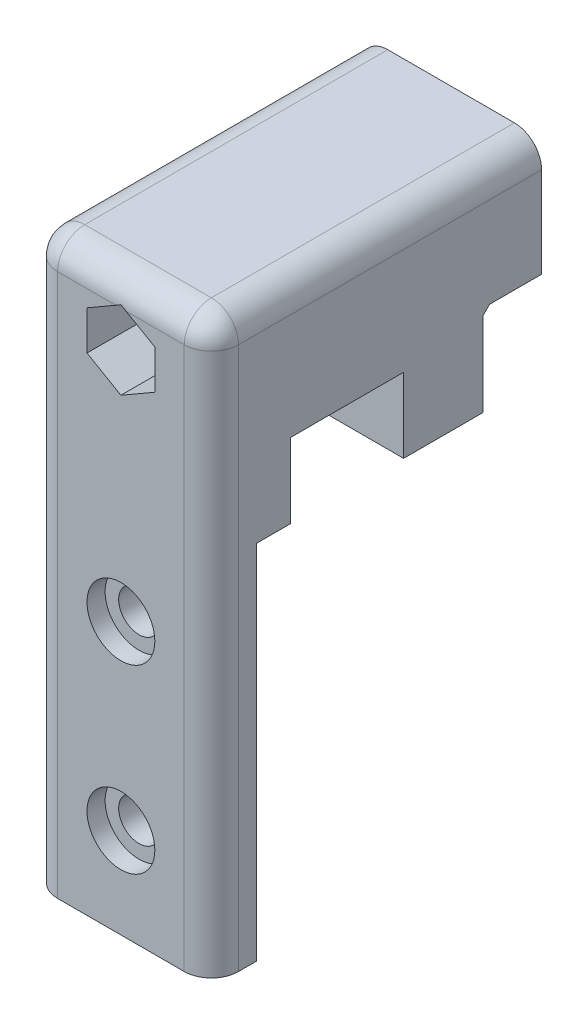
ISO-10303-21;
HEADER;
FILE_DESCRIPTION(('STEP AP214'),'2;1');
FILE_NAME('part.step','',(''),(''),'','','');
FILE_SCHEMA(('AUTOMOTIVE_DESIGN { 1 0 10303 214 1 1 1 1 }'));
ENDSEC;
DATA;
#1=APPLICATION_CONTEXT('core data for automotive mechanical design processes');
#2=APPLICATION_PROTOCOL_DEFINITION('international standard','automotive_design',2000,#1);
#3=PRODUCT_CONTEXT('',#1,'mechanical');
#4=PRODUCT('Part','Part','',(#3));
#5=PRODUCT_RELATED_PRODUCT_CATEGORY('part','',(#4));
#6=PRODUCT_DEFINITION_FORMATION('','',#4);
#7=PRODUCT_DEFINITION_CONTEXT('part definition',#1,'design');
#8=PRODUCT_DEFINITION('design','',#6,#7);
#9=PRODUCT_DEFINITION_SHAPE('','',#8);
#10=(LENGTH_UNIT() NAMED_UNIT(*) SI_UNIT(.MILLI.,.METRE.));
#11=(NAMED_UNIT(*) PLANE_ANGLE_UNIT() SI_UNIT($,.RADIAN.));
#12=(NAMED_UNIT(*) SI_UNIT($,.STERADIAN.) SOLID_ANGLE_UNIT());
#13=UNCERTAINTY_MEASURE_WITH_UNIT(LENGTH_MEASURE(1.E-05),#10,'distance_accuracy_value','');
#14=(GEOMETRIC_REPRESENTATION_CONTEXT(3) GLOBAL_UNCERTAINTY_ASSIGNED_CONTEXT((#13)) GLOBAL_UNIT_ASSIGNED_CONTEXT((#10,
#11,#12)) REPRESENTATION_CONTEXT('',''));
#15=CARTESIAN_POINT('',(0.,0.,0.));
#16=DIRECTION('',(0.,0.,1.));
#17=DIRECTION('',(1.,0.,0.));
#18=AXIS2_PLACEMENT_3D('',#15,#16,#17);
#19=CARTESIAN_POINT('',(9.99999999999692,15.9999999999996,-15.2510000000009));
#20=DIRECTION('',(0.,0.,1.));
#21=DIRECTION('',(1.,0.,0.));
#22=AXIS2_PLACEMENT_3D('',#19,#20,#21);
#23=CYLINDRICAL_SURFACE('',#22,2.25000000000298);
#24=CARTESIAN_POINT('',(9.99999999999692,15.9999999999996,-15.250000000001));
#25=DIRECTION('',(0.,0.,1.));
#26=DIRECTION('',(1.,0.,0.));
#27=AXIS2_PLACEMENT_3D('',#24,#25,#26);
#28=CIRCLE('',#27,2.25000000000298);
#29=CARTESIAN_POINT('',(12.2499999999999,15.9999999999996,-15.250000000001));
#30=VERTEX_POINT('',#29);
#31=EDGE_CURVE('E312',#30,#30,#28,.F.);
#32=ORIENTED_EDGE('',*,*,#31,.T.);
#33=EDGE_LOOP('',(#32));
#34=FACE_BOUND('',#33,.T.);
#35=CARTESIAN_POINT('',(9.99999999999692,15.9999999999996,9.25));
#36=DIRECTION('',(0.,0.,1.));
#37=DIRECTION('',(1.,0.,0.));
#38=AXIS2_PLACEMENT_3D('',#35,#36,#37);
#39=CIRCLE('',#38,2.25000000000298);
#40=CARTESIAN_POINT('',(12.2499999999999,15.9999999999996,9.25));
#41=VERTEX_POINT('',#40);
#42=EDGE_CURVE('E43',#41,#41,#39,.F.);
#43=ORIENTED_EDGE('',*,*,#42,.F.);
#44=EDGE_LOOP('',(#43));
#45=FACE_BOUND('',#44,.T.);
#46=ADVANCED_FACE('F39',(#34,#45),#23,.F.);
#47=CARTESIAN_POINT('',(20.,22.9999999999997,19.25));
#48=DIRECTION('',(0.,0.,-1.));
#49=DIRECTION('',(0.,1.,0.));
#50=AXIS2_PLACEMENT_3D('',#47,#48,#49);
#51=PLANE('',#50);
#52=CARTESIAN_POINT('',(10.,-10.,19.25));
#53=DIRECTION('',(0.,0.,1.));
#54=DIRECTION('',(1.,0.,0.));
#55=AXIS2_PLACEMENT_3D('',#52,#53,#54);
#56=CIRCLE('',#55,3.75);
#57=CARTESIAN_POINT('',(13.75,-10.,19.25));
#58=VERTEX_POINT('',#57);
#59=EDGE_CURVE('E296',#58,#58,#56,.T.);
#60=ORIENTED_EDGE('',*,*,#59,.T.);
#61=EDGE_LOOP('',(#60));
#62=FACE_BOUND('',#61,.T.);
#63=CARTESIAN_POINT('',(10.,-10.,19.25));
#64=DIRECTION('',(0.,0.,1.));
#65=DIRECTION('',(1.,0.,0.));
#66=AXIS2_PLACEMENT_3D('',#63,#64,#65);
#67=CIRCLE('',#66,2.25);
#68=CARTESIAN_POINT('',(12.25,-10.,19.25));
#69=VERTEX_POINT('',#68);
#70=EDGE_CURVE('E321',#69,#69,#67,.T.);
#71=ORIENTED_EDGE('',*,*,#70,.F.);
#72=EDGE_LOOP('',(#71));
#73=FACE_BOUND('',#72,.T.);
#74=ADVANCED_FACE('F557',(#62,#73),#51,.F.);
#75=CARTESIAN_POINT('',(10.,-30.,19.25));
#76=DIRECTION('',(0.,0.,1.));
#77=DIRECTION('',(1.,0.,0.));
#78=AXIS2_PLACEMENT_3D('',#75,#76,#77);
#79=CIRCLE('',#78,3.75);
#80=CARTESIAN_POINT('',(13.75,-30.,19.25));
#81=VERTEX_POINT('',#80);
#82=EDGE_CURVE('E301',#81,#81,#79,.T.);
#83=ORIENTED_EDGE('',*,*,#82,.T.);
#84=EDGE_LOOP('',(#83));
#85=FACE_BOUND('',#84,.T.);
#86=CARTESIAN_POINT('',(10.,-30.,19.25));
#87=DIRECTION('',(0.,0.,1.));
#88=DIRECTION('',(1.,0.,0.));
#89=AXIS2_PLACEMENT_3D('',#86,#87,#88);
#90=CIRCLE('',#89,2.25);
#91=CARTESIAN_POINT('',(12.25,-30.,19.25));
#92=VERTEX_POINT('',#91);
#93=EDGE_CURVE('E313',#92,#92,#90,.T.);
#94=ORIENTED_EDGE('',*,*,#93,.F.);
#95=EDGE_LOOP('',(#94));
#96=FACE_BOUND('',#95,.T.);
#97=ADVANCED_FACE('F563',(#85,#96),#51,.F.);
#98=CARTESIAN_POINT('',(20.,0.,-8.75000000000095));
#99=DIRECTION('',(0.,0.,1.));
#100=DIRECTION('',(1.,0.,0.));
#101=AXIS2_PLACEMENT_3D('',#98,#99,#100);
#102=PLANE('',#101);
#103=DIRECTION('',(0.,1.,0.));
#104=VECTOR('',#103,1.);
#105=CARTESIAN_POINT('',(0.,0.,-8.75000000000095));
#106=LINE('',#105,#104);
#107=CARTESIAN_POINT('',(0.,0.,-8.75000000000095));
#108=VERTEX_POINT('',#107);
#109=CARTESIAN_POINT('',(0.,9.24999999999966,-8.75000000000095));
#110=VERTEX_POINT('',#109);
#111=EDGE_CURVE('E320',#108,#110,#106,.T.);
#112=ORIENTED_EDGE('',*,*,#111,.T.);
#113=DIRECTION('',(-1.,0.,0.));
#114=VECTOR('',#113,1.);
#115=CARTESIAN_POINT('',(20.,9.24999999999966,-8.75000000000095));
#116=LINE('',#115,#114);
#117=CARTESIAN_POINT('',(20.,9.24999999999966,-8.75000000000095));
#118=VERTEX_POINT('',#117);
#119=EDGE_CURVE('E425',#118,#110,#116,.T.);
#120=ORIENTED_EDGE('',*,*,#119,.F.);
#121=DIRECTION('',(0.,1.,0.));
#122=VECTOR('',#121,1.);
#123=CARTESIAN_POINT('',(20.,0.,-8.75000000000095));
#124=LINE('',#123,#122);
#125=CARTESIAN_POINT('',(20.,0.,-8.75000000000095));
#126=VERTEX_POINT('',#125);
#127=EDGE_CURVE('E333',#126,#118,#124,.T.);
#128=ORIENTED_EDGE('',*,*,#127,.F.);
#129=DIRECTION('',(-1.,0.,0.));
#130=VECTOR('',#129,1.);
#131=CARTESIAN_POINT('',(20.,0.,-8.75000000000095));
#132=LINE('',#131,#130);
#133=EDGE_CURVE('E429',#126,#108,#132,.T.);
#134=ORIENTED_EDGE('',*,*,#133,.T.);
#135=EDGE_LOOP('',(#112,#120,#128,#134));
#136=FACE_BOUND('',#135,.T.);
#137=ADVANCED_FACE('F613',(#136),#102,.F.);
#138=CARTESIAN_POINT('',(20.,9.24999999999966,-8.75000000000095));
#139=DIRECTION('',(0.,0.707106781186546,0.707106781186549));
#140=DIRECTION('',(0.,-0.707106781186549,0.707106781186546));
#141=AXIS2_PLACEMENT_3D('',#138,#139,#140);
#142=PLANE('',#141);
#143=DIRECTION('',(0.,0.707106781186549,-0.707106781186546));
#144=VECTOR('',#143,1.);
#145=CARTESIAN_POINT('',(0.,9.24999999999966,-8.75000000000095));
#146=LINE('',#145,#144);
#147=CARTESIAN_POINT('',(0.,9.99999999999966,-9.50000000000095));
#148=VERTEX_POINT('',#147);
#149=EDGE_CURVE('E362',#110,#148,#146,.T.);
#150=ORIENTED_EDGE('',*,*,#149,.T.);
#151=DIRECTION('',(-1.,0.,0.));
#152=VECTOR('',#151,1.);
#153=CARTESIAN_POINT('',(20.,9.99999999999966,-9.50000000000095));
#154=LINE('',#153,#152);
#155=CARTESIAN_POINT('',(20.,9.99999999999966,-9.50000000000095));
#156=VERTEX_POINT('',#155);
#157=EDGE_CURVE('E421',#156,#148,#154,.T.);
#158=ORIENTED_EDGE('',*,*,#157,.F.);
#159=DIRECTION('',(0.,0.707106781186549,-0.707106781186546));
#160=VECTOR('',#159,1.);
#161=CARTESIAN_POINT('',(20.,9.24999999999966,-8.75000000000095));
#162=LINE('',#161,#160);
#163=EDGE_CURVE('E336',#118,#156,#162,.T.);
#164=ORIENTED_EDGE('',*,*,#163,.F.);
#165=ORIENTED_EDGE('',*,*,#119,.T.);
#166=EDGE_LOOP('',(#150,#158,#164,#165));
#167=FACE_BOUND('',#166,.T.);
#168=ADVANCED_FACE('F609',(#167),#142,.F.);
#169=CARTESIAN_POINT('',(20.,9.99999999999966,-9.50000000000095));
#170=DIRECTION('',(0.,1.,0.));
#171=DIRECTION('',(0.,0.,1.));
#172=AXIS2_PLACEMENT_3D('',#169,#170,#171);
#173=PLANE('',#172);
#174=DIRECTION('',(0.,0.,-1.));
#175=VECTOR('',#174,1.);
#176=CARTESIAN_POINT('',(0.,9.99999999999966,-9.50000000000095));
#177=LINE('',#176,#175);
#178=CARTESIAN_POINT('',(0.,9.99999999999966,-15.250000000001));
#179=VERTEX_POINT('',#178);
#180=EDGE_CURVE('E365',#148,#179,#177,.T.);
#181=ORIENTED_EDGE('',*,*,#180,.T.);
#182=DIRECTION('',(-1.,0.,0.));
#183=VECTOR('',#182,1.);
#184=CARTESIAN_POINT('',(20.,9.99999999999966,-15.250000000001));
#185=LINE('',#184,#183);
#186=CARTESIAN_POINT('',(20.,9.99999999999966,-15.250000000001));
#187=VERTEX_POINT('',#186);
#188=EDGE_CURVE('E417',#187,#179,#185,.T.);
#189=ORIENTED_EDGE('',*,*,#188,.F.);
#190=DIRECTION('',(0.,0.,-1.));
#191=VECTOR('',#190,1.);
#192=CARTESIAN_POINT('',(20.,9.99999999999966,-9.50000000000095));
#193=LINE('',#192,#191);
#194=EDGE_CURVE('E338',#156,#187,#193,.T.);
#195=ORIENTED_EDGE('',*,*,#194,.F.);
#196=ORIENTED_EDGE('',*,*,#157,.T.);
#197=EDGE_LOOP('',(#181,#189,#195,#196));
#198=FACE_BOUND('',#197,.T.);
#199=ADVANCED_FACE('F605',(#198),#173,.F.);
#200=CARTESIAN_POINT('',(20.,9.99999999999966,-15.250000000001));
#201=DIRECTION('',(0.,0.,1.));
#202=DIRECTION('',(1.,0.,0.));
#203=AXIS2_PLACEMENT_3D('',#200,#201,#202);
#204=PLANE('',#203);
#205=ORIENTED_EDGE('',*,*,#31,.F.);
#206=EDGE_LOOP('',(#205));
#207=FACE_BOUND('',#206,.T.);
#208=DIRECTION('',(0.,1.,0.));
#209=VECTOR('',#208,1.);
#210=CARTESIAN_POINT('',(0.,9.99999999999966,-15.250000000001));
#211=LINE('',#210,#209);
#212=CARTESIAN_POINT('',(0.,19.9999999999996,-15.250000000001));
#213=VERTEX_POINT('',#212);
#214=EDGE_CURVE('E368',#179,#213,#211,.T.);
#215=ORIENTED_EDGE('',*,*,#214,.T.);
#216=CARTESIAN_POINT('',(3.,19.9999999999996,-15.250000000001));
#217=DIRECTION('',(0.,0.,1.));
#218=DIRECTION('',(1.,0.,0.));
#219=AXIS2_PLACEMENT_3D('',#216,#217,#218);
#220=CIRCLE('',#219,3.);
#221=CARTESIAN_POINT('',(3.,22.9999999999996,-15.250000000001));
#222=VERTEX_POINT('',#221);
#223=EDGE_CURVE('E449',#213,#222,#220,.F.);
#224=ORIENTED_EDGE('',*,*,#223,.T.);
#225=DIRECTION('',(-1.,0.,0.));
#226=VECTOR('',#225,1.);
#227=CARTESIAN_POINT('',(20.,22.9999999999996,-15.250000000001));
#228=LINE('',#227,#226);
#229=CARTESIAN_POINT('',(17.,22.9999999999996,-15.250000000001));
#230=VERTEX_POINT('',#229);
#231=EDGE_CURVE('E413',#230,#222,#228,.T.);
#232=ORIENTED_EDGE('',*,*,#231,.F.);
#233=CARTESIAN_POINT('',(17.,19.9999999999996,-15.250000000001));
#234=DIRECTION('',(0.,0.,1.));
#235=DIRECTION('',(1.,0.,0.));
#236=AXIS2_PLACEMENT_3D('',#233,#234,#235);
#237=CIRCLE('',#236,3.);
#238=CARTESIAN_POINT('',(20.,19.9999999999996,-15.250000000001));
#239=VERTEX_POINT('',#238);
#240=EDGE_CURVE('E447',#230,#239,#237,.F.);
#241=ORIENTED_EDGE('',*,*,#240,.T.);
#242=DIRECTION('',(0.,1.,0.));
#243=VECTOR('',#242,1.);
#244=CARTESIAN_POINT('',(20.,9.99999999999966,-15.250000000001));
#245=LINE('',#244,#243);
#246=EDGE_CURVE('E340',#187,#239,#245,.T.);
#247=ORIENTED_EDGE('',*,*,#246,.F.);
#248=ORIENTED_EDGE('',*,*,#188,.T.);
#249=EDGE_LOOP('',(#215,#224,#232,#241,#247,#248));
#250=FACE_BOUND('',#249,.T.);
#251=ADVANCED_FACE('F601',(#207,#250),#204,.F.);
#252=CARTESIAN_POINT('',(20.,22.9999999999996,-15.250000000001));
#253=DIRECTION('',(0.,-1.,0.));
#254=DIRECTION('',(0.,0.,-1.));
#255=AXIS2_PLACEMENT_3D('',#252,#253,#254);
#256=PLANE('',#255);
#257=ORIENTED_EDGE('',*,*,#231,.T.);
#258=DIRECTION('',(0.,0.,1.));
#259=VECTOR('',#258,1.);
#260=CARTESIAN_POINT('',(3.,22.9999999999996,-15.250000000001));
#261=LINE('',#260,#259);
#262=CARTESIAN_POINT('',(3.,22.9999999999997,18.25));
#263=VERTEX_POINT('',#262);
#264=EDGE_CURVE('E437',#222,#263,#261,.T.);
#265=ORIENTED_EDGE('',*,*,#264,.T.);
#266=DIRECTION('',(-1.,0.,0.));
#267=VECTOR('',#266,1.);
#268=CARTESIAN_POINT('',(20.,22.9999999999997,18.25));
#269=LINE('',#268,#267);
#270=CARTESIAN_POINT('',(17.,22.9999999999997,18.25));
#271=VERTEX_POINT('',#270);
#272=EDGE_CURVE('E433',#263,#271,#269,.F.);
#273=ORIENTED_EDGE('',*,*,#272,.T.);
#274=DIRECTION('',(0.,0.,1.));
#275=VECTOR('',#274,1.);
#276=CARTESIAN_POINT('',(17.,22.9999999999996,-15.250000000001));
#277=LINE('',#276,#275);
#278=EDGE_CURVE('E435',#271,#230,#277,.F.);
#279=ORIENTED_EDGE('',*,*,#278,.T.);
#280=EDGE_LOOP('',(#257,#265,#273,#279));
#281=FACE_BOUND('',#280,.T.);
#282=ADVANCED_FACE('F597',(#281),#256,.F.);
#283=CARTESIAN_POINT('',(20.,-40.,19.25));
#284=DIRECTION('',(0.,1.,0.));
#285=DIRECTION('',(0.,0.,1.));
#286=AXIS2_PLACEMENT_3D('',#283,#284,#285);
#287=PLANE('',#286);
#288=DIRECTION('',(0.,0.,-1.));
#289=VECTOR('',#288,1.);
#290=CARTESIAN_POINT('',(20.,-40.,19.25));
#291=LINE('',#290,#289);
#292=CARTESIAN_POINT('',(20.,-40.,18.25));
#293=VERTEX_POINT('',#292);
#294=CARTESIAN_POINT('',(20.,-40.,16.25));
#295=VERTEX_POINT('',#294);
#296=EDGE_CURVE('E343',#293,#295,#291,.T.);
#297=ORIENTED_EDGE('',*,*,#296,.F.);
#298=CARTESIAN_POINT('',(17.,-40.,18.25));
#299=DIRECTION('',(0.,1.,0.));
#300=DIRECTION('',(0.,0.,1.));
#301=AXIS2_PLACEMENT_3D('',#298,#299,#300);
#302=CIRCLE('',#301,3.);
#303=CARTESIAN_POINT('',(17.,-40.,21.25));
#304=VERTEX_POINT('',#303);
#305=EDGE_CURVE('E11',#293,#304,#302,.F.);
#306=ORIENTED_EDGE('',*,*,#305,.T.);
#307=DIRECTION('',(1.,0.,0.));
#308=VECTOR('',#307,1.);
#309=CARTESIAN_POINT('',(0.,-40.,21.25));
#310=LINE('',#309,#308);
#311=CARTESIAN_POINT('',(3.,-40.,21.25));
#312=VERTEX_POINT('',#311);
#313=EDGE_CURVE('E308',#312,#304,#310,.T.);
#314=ORIENTED_EDGE('',*,*,#313,.F.);
#315=CARTESIAN_POINT('',(3.,-40.,18.25));
#316=DIRECTION('',(0.,1.,0.));
#317=DIRECTION('',(0.,0.,1.));
#318=AXIS2_PLACEMENT_3D('',#315,#316,#317);
#319=CIRCLE('',#318,3.);
#320=CARTESIAN_POINT('',(0.,-40.,18.25));
#321=VERTEX_POINT('',#320);
#322=EDGE_CURVE('E48',#312,#321,#319,.F.);
#323=ORIENTED_EDGE('',*,*,#322,.T.);
#324=DIRECTION('',(0.,0.,-1.));
#325=VECTOR('',#324,1.);
#326=CARTESIAN_POINT('',(0.,-40.,19.25));
#327=LINE('',#326,#325);
#328=CARTESIAN_POINT('',(0.,-40.,16.25));
#329=VERTEX_POINT('',#328);
#330=EDGE_CURVE('E372',#321,#329,#327,.T.);
#331=ORIENTED_EDGE('',*,*,#330,.T.);
#332=DIRECTION('',(-1.,0.,0.));
#333=VECTOR('',#332,1.);
#334=CARTESIAN_POINT('',(20.,-40.,16.25));
#335=LINE('',#334,#333);
#336=EDGE_CURVE('E410',#295,#329,#335,.T.);
#337=ORIENTED_EDGE('',*,*,#336,.F.);
#338=EDGE_LOOP('',(#297,#306,#314,#323,#331,#337));
#339=FACE_BOUND('',#338,.T.);
#340=ADVANCED_FACE('F527',(#339),#287,.F.);
#341=CARTESIAN_POINT('',(20.,-40.,16.25));
#342=DIRECTION('',(0.,0.,1.));
#343=DIRECTION('',(1.,0.,0.));
#344=AXIS2_PLACEMENT_3D('',#341,#342,#343);
#345=PLANE('',#344);
#346=CARTESIAN_POINT('',(10.,-30.,16.25));
#347=DIRECTION('',(0.,0.,1.));
#348=DIRECTION('',(1.,0.,0.));
#349=AXIS2_PLACEMENT_3D('',#346,#347,#348);
#350=CIRCLE('',#349,2.25);
#351=CARTESIAN_POINT('',(12.25,-30.,16.25));
#352=VERTEX_POINT('',#351);
#353=EDGE_CURVE('E316',#352,#352,#350,.F.);
#354=ORIENTED_EDGE('',*,*,#353,.F.);
#355=EDGE_LOOP('',(#354));
#356=FACE_BOUND('',#355,.T.);
#357=CARTESIAN_POINT('',(10.,-10.,16.25));
#358=DIRECTION('',(0.,0.,1.));
#359=DIRECTION('',(1.,0.,0.));
#360=AXIS2_PLACEMENT_3D('',#357,#358,#359);
#361=CIRCLE('',#360,2.25);
#362=CARTESIAN_POINT('',(12.25,-10.,16.25));
#363=VERTEX_POINT('',#362);
#364=EDGE_CURVE('E317',#363,#363,#361,.F.);
#365=ORIENTED_EDGE('',*,*,#364,.F.);
#366=EDGE_LOOP('',(#365));
#367=FACE_BOUND('',#366,.T.);
#368=DIRECTION('',(0.,1.,0.));
#369=VECTOR('',#368,1.);
#370=CARTESIAN_POINT('',(0.,-40.,16.25));
#371=LINE('',#370,#369);
#372=CARTESIAN_POINT('',(0.,0.,16.25));
#373=VERTEX_POINT('',#372);
#374=EDGE_CURVE('E374',#329,#373,#371,.T.);
#375=ORIENTED_EDGE('',*,*,#374,.T.);
#376=DIRECTION('',(-1.,0.,0.));
#377=VECTOR('',#376,1.);
#378=CARTESIAN_POINT('',(20.,0.,16.25));
#379=LINE('',#378,#377);
#380=CARTESIAN_POINT('',(20.,0.,16.25));
#381=VERTEX_POINT('',#380);
#382=EDGE_CURVE('E406',#381,#373,#379,.T.);
#383=ORIENTED_EDGE('',*,*,#382,.F.);
#384=DIRECTION('',(0.,1.,0.));
#385=VECTOR('',#384,1.);
#386=CARTESIAN_POINT('',(20.,-40.,16.25));
#387=LINE('',#386,#385);
#388=EDGE_CURVE('E345',#295,#381,#387,.T.);
#389=ORIENTED_EDGE('',*,*,#388,.F.);
#390=ORIENTED_EDGE('',*,*,#336,.T.);
#391=EDGE_LOOP('',(#375,#383,#389,#390));
#392=FACE_BOUND('',#391,.T.);
#393=ADVANCED_FACE('F536',(#356,#367,#392),#345,.F.);
#394=CARTESIAN_POINT('',(20.,0.,16.25));
#395=DIRECTION('',(0.,1.,0.));
#396=DIRECTION('',(0.,0.,1.));
#397=AXIS2_PLACEMENT_3D('',#394,#395,#396);
#398=PLANE('',#397);
#399=DIRECTION('',(0.,0.,-1.));
#400=VECTOR('',#399,1.);
#401=CARTESIAN_POINT('',(0.,0.,16.25));
#402=LINE('',#401,#400);
#403=CARTESIAN_POINT('',(0.,0.,12.5));
#404=VERTEX_POINT('',#403);
#405=EDGE_CURVE('E377',#373,#404,#402,.T.);
#406=ORIENTED_EDGE('',*,*,#405,.T.);
#407=DIRECTION('',(-1.,0.,0.));
#408=VECTOR('',#407,1.);
#409=CARTESIAN_POINT('',(20.,0.,12.5));
#410=LINE('',#409,#408);
#411=CARTESIAN_POINT('',(20.,0.,12.5));
#412=VERTEX_POINT('',#411);
#413=EDGE_CURVE('E402',#412,#404,#410,.T.);
#414=ORIENTED_EDGE('',*,*,#413,.F.);
#415=DIRECTION('',(0.,0.,-1.));
#416=VECTOR('',#415,1.);
#417=CARTESIAN_POINT('',(20.,0.,16.25));
#418=LINE('',#417,#416);
#419=EDGE_CURVE('E348',#381,#412,#418,.T.);
#420=ORIENTED_EDGE('',*,*,#419,.F.);
#421=ORIENTED_EDGE('',*,*,#382,.T.);
#422=EDGE_LOOP('',(#406,#414,#420,#421));
#423=FACE_BOUND('',#422,.T.);
#424=ADVANCED_FACE('F540',(#423),#398,.F.);
#425=CARTESIAN_POINT('',(20.,0.,12.5));
#426=DIRECTION('',(0.,0.,1.));
#427=DIRECTION('',(1.,0.,0.));
#428=AXIS2_PLACEMENT_3D('',#425,#426,#427);
#429=PLANE('',#428);
#430=DIRECTION('',(0.,1.,0.));
#431=VECTOR('',#430,1.);
#432=CARTESIAN_POINT('',(0.,0.,12.5));
#433=LINE('',#432,#431);
#434=CARTESIAN_POINT('',(0.,8.25,12.5));
#435=VERTEX_POINT('',#434);
#436=EDGE_CURVE('E380',#404,#435,#433,.T.);
#437=ORIENTED_EDGE('',*,*,#436,.T.);
#438=DIRECTION('',(-1.,0.,0.));
#439=VECTOR('',#438,1.);
#440=CARTESIAN_POINT('',(20.,8.25,12.5));
#441=LINE('',#440,#439);
#442=CARTESIAN_POINT('',(20.,8.25,12.5));
#443=VERTEX_POINT('',#442);
#444=EDGE_CURVE('E398',#443,#435,#441,.T.);
#445=ORIENTED_EDGE('',*,*,#444,.F.);
#446=DIRECTION('',(0.,1.,0.));
#447=VECTOR('',#446,1.);
#448=CARTESIAN_POINT('',(20.,0.,12.5));
#449=LINE('',#448,#447);
#450=EDGE_CURVE('E351',#412,#443,#449,.T.);
#451=ORIENTED_EDGE('',*,*,#450,.F.);
#452=ORIENTED_EDGE('',*,*,#413,.T.);
#453=EDGE_LOOP('',(#437,#445,#451,#452));
#454=FACE_BOUND('',#453,.T.);
#455=ADVANCED_FACE('F586',(#454),#429,.F.);
#456=CARTESIAN_POINT('',(20.,8.25,12.5));
#457=DIRECTION('',(0.,1.,0.));
#458=DIRECTION('',(0.,0.,1.));
#459=AXIS2_PLACEMENT_3D('',#456,#457,#458);
#460=PLANE('',#459);
#461=DIRECTION('',(0.,0.,-1.));
#462=VECTOR('',#461,1.);
#463=CARTESIAN_POINT('',(0.,8.25,12.5));
#464=LINE('',#463,#462);
#465=CARTESIAN_POINT('',(0.,8.25,0.));
#466=VERTEX_POINT('',#465);
#467=EDGE_CURVE('E383',#435,#466,#464,.T.);
#468=ORIENTED_EDGE('',*,*,#467,.T.);
#469=DIRECTION('',(-1.,0.,0.));
#470=VECTOR('',#469,1.);
#471=CARTESIAN_POINT('',(20.,8.25,0.));
#472=LINE('',#471,#470);
#473=CARTESIAN_POINT('',(20.,8.25,0.));
#474=VERTEX_POINT('',#473);
#475=EDGE_CURVE('E394',#474,#466,#472,.T.);
#476=ORIENTED_EDGE('',*,*,#475,.F.);
#477=DIRECTION('',(0.,0.,-1.));
#478=VECTOR('',#477,1.);
#479=CARTESIAN_POINT('',(20.,8.25,12.5));
#480=LINE('',#479,#478);
#481=EDGE_CURVE('E354',#443,#474,#480,.T.);
#482=ORIENTED_EDGE('',*,*,#481,.F.);
#483=ORIENTED_EDGE('',*,*,#444,.T.);
#484=EDGE_LOOP('',(#468,#476,#482,#483));
#485=FACE_BOUND('',#484,.T.);
#486=ADVANCED_FACE('F582',(#485),#460,.F.);
#487=CARTESIAN_POINT('',(20.,8.25,0.));
#488=DIRECTION('',(0.,0.,-1.));
#489=DIRECTION('',(0.,1.,0.));
#490=AXIS2_PLACEMENT_3D('',#487,#488,#489);
#491=PLANE('',#490);
#492=DIRECTION('',(0.,-1.,0.));
#493=VECTOR('',#492,1.);
#494=CARTESIAN_POINT('',(0.,8.25,0.));
#495=LINE('',#494,#493);
#496=CARTESIAN_POINT('',(0.,0.,0.));
#497=VERTEX_POINT('',#496);
#498=EDGE_CURVE('E386',#466,#497,#495,.T.);
#499=ORIENTED_EDGE('',*,*,#498,.T.);
#500=DIRECTION('',(-1.,0.,0.));
#501=VECTOR('',#500,1.);
#502=CARTESIAN_POINT('',(20.,0.,0.));
#503=LINE('',#502,#501);
#504=CARTESIAN_POINT('',(20.,0.,0.));
#505=VERTEX_POINT('',#504);
#506=EDGE_CURVE('E359',#505,#497,#503,.T.);
#507=ORIENTED_EDGE('',*,*,#506,.F.);
#508=DIRECTION('',(0.,-1.,0.));
#509=VECTOR('',#508,1.);
#510=CARTESIAN_POINT('',(20.,8.25,0.));
#511=LINE('',#510,#509);
#512=EDGE_CURVE('E356',#474,#505,#511,.T.);
#513=ORIENTED_EDGE('',*,*,#512,.F.);
#514=ORIENTED_EDGE('',*,*,#475,.T.);
#515=EDGE_LOOP('',(#499,#507,#513,#514));
#516=FACE_BOUND('',#515,.T.);
#517=ADVANCED_FACE('F578',(#516),#491,.F.);
#518=CARTESIAN_POINT('',(20.,0.,0.));
#519=DIRECTION('',(0.,1.,0.));
#520=DIRECTION('',(0.,0.,1.));
#521=AXIS2_PLACEMENT_3D('',#518,#519,#520);
#522=PLANE('',#521);
#523=DIRECTION('',(0.,0.,-1.));
#524=VECTOR('',#523,1.);
#525=CARTESIAN_POINT('',(0.,0.,0.));
#526=LINE('',#525,#524);
#527=EDGE_CURVE('E334',#497,#108,#526,.T.);
#528=ORIENTED_EDGE('',*,*,#527,.T.);
#529=ORIENTED_EDGE('',*,*,#133,.F.);
#530=DIRECTION('',(0.,0.,-1.));
#531=VECTOR('',#530,1.);
#532=CARTESIAN_POINT('',(20.,0.,-3.75));
#533=LINE('',#532,#531);
#534=EDGE_CURVE('E330',#505,#126,#533,.T.);
#535=ORIENTED_EDGE('',*,*,#534,.F.);
#536=ORIENTED_EDGE('',*,*,#506,.T.);
#537=EDGE_LOOP('',(#528,#529,#535,#536));
#538=FACE_BOUND('',#537,.T.);
#539=ADVANCED_FACE('F573',(#538),#522,.F.);
#540=CARTESIAN_POINT('',(20.,0.,0.));
#541=DIRECTION('',(1.,0.,0.));
#542=DIRECTION('',(0.,0.,-1.));
#543=AXIS2_PLACEMENT_3D('',#540,#541,#542);
#544=PLANE('',#543);
#545=ORIENTED_EDGE('',*,*,#246,.T.);
#546=DIRECTION('',(0.,0.,1.));
#547=VECTOR('',#546,1.);
#548=CARTESIAN_POINT('',(20.,19.9999999999997,21.25));
#549=LINE('',#548,#547);
#550=CARTESIAN_POINT('',(20.,19.9999999999997,18.25));
#551=VERTEX_POINT('',#550);
#552=EDGE_CURVE('E454',#239,#551,#549,.T.);
#553=ORIENTED_EDGE('',*,*,#552,.T.);
#554=DIRECTION('',(0.,1.,0.));
#555=VECTOR('',#554,1.);
#556=CARTESIAN_POINT('',(20.,0.,18.25));
#557=LINE('',#556,#555);
#558=EDGE_CURVE('E451',#551,#293,#557,.F.);
#559=ORIENTED_EDGE('',*,*,#558,.T.);
#560=ORIENTED_EDGE('',*,*,#296,.T.);
#561=ORIENTED_EDGE('',*,*,#388,.T.);
#562=ORIENTED_EDGE('',*,*,#419,.T.);
#563=ORIENTED_EDGE('',*,*,#450,.T.);
#564=ORIENTED_EDGE('',*,*,#481,.T.);
#565=ORIENTED_EDGE('',*,*,#512,.T.);
#566=ORIENTED_EDGE('',*,*,#534,.T.);
#567=ORIENTED_EDGE('',*,*,#127,.T.);
#568=ORIENTED_EDGE('',*,*,#163,.T.);
#569=ORIENTED_EDGE('',*,*,#194,.T.);
#570=EDGE_LOOP('',(#545,#553,#559,#560,#561,#562,#563,#564,#565,#566,#567,#568,#569));
#571=FACE_BOUND('',#570,.T.);
#572=ADVANCED_FACE('F544',(#571),#544,.T.);
#573=CARTESIAN_POINT('',(0.,0.,0.));
#574=DIRECTION('',(1.,0.,0.));
#575=DIRECTION('',(0.,0.,-1.));
#576=AXIS2_PLACEMENT_3D('',#573,#574,#575);
#577=PLANE('',#576);
#578=DIRECTION('',(0.,-1.,0.));
#579=VECTOR('',#578,1.);
#580=CARTESIAN_POINT('',(0.,22.9999999999997,18.25));
#581=LINE('',#580,#579);
#582=CARTESIAN_POINT('',(0.,19.9999999999997,18.25));
#583=VERTEX_POINT('',#582);
#584=EDGE_CURVE('E441',#321,#583,#581,.F.);
#585=ORIENTED_EDGE('',*,*,#584,.T.);
#586=DIRECTION('',(0.,0.,1.));
#587=VECTOR('',#586,1.);
#588=CARTESIAN_POINT('',(0.,19.9999999999997,0.));
#589=LINE('',#588,#587);
#590=EDGE_CURVE('E444',#583,#213,#589,.F.);
#591=ORIENTED_EDGE('',*,*,#590,.T.);
#592=ORIENTED_EDGE('',*,*,#214,.F.);
#593=ORIENTED_EDGE('',*,*,#180,.F.);
#594=ORIENTED_EDGE('',*,*,#149,.F.);
#595=ORIENTED_EDGE('',*,*,#111,.F.);
#596=ORIENTED_EDGE('',*,*,#527,.F.);
#597=ORIENTED_EDGE('',*,*,#498,.F.);
#598=ORIENTED_EDGE('',*,*,#467,.F.);
#599=ORIENTED_EDGE('',*,*,#436,.F.);
#600=ORIENTED_EDGE('',*,*,#405,.F.);
#601=ORIENTED_EDGE('',*,*,#374,.F.);
#602=ORIENTED_EDGE('',*,*,#330,.F.);
#603=EDGE_LOOP('',(#585,#591,#592,#593,#594,#595,#596,#597,#598,#599,#600,#601,#602));
#604=FACE_BOUND('',#603,.T.);
#605=ADVANCED_FACE('F531',(#604),#577,.F.);
#606=CARTESIAN_POINT('',(10.,-10.,-15.2510000000009));
#607=DIRECTION('',(0.,0.,1.));
#608=DIRECTION('',(1.,0.,0.));
#609=AXIS2_PLACEMENT_3D('',#606,#607,#608);
#610=CYLINDRICAL_SURFACE('',#609,2.25);
#611=ORIENTED_EDGE('',*,*,#70,.T.);
#612=EDGE_LOOP('',(#611));
#613=FACE_BOUND('',#612,.T.);
#614=ORIENTED_EDGE('',*,*,#364,.T.);
#615=EDGE_LOOP('',(#614));
#616=FACE_BOUND('',#615,.T.);
#617=ADVANCED_FACE('F569',(#613,#616),#610,.F.);
#618=CARTESIAN_POINT('',(10.,-30.,-15.2510000000009));
#619=DIRECTION('',(0.,0.,1.));
#620=DIRECTION('',(1.,0.,0.));
#621=AXIS2_PLACEMENT_3D('',#618,#619,#620);
#622=CYLINDRICAL_SURFACE('',#621,2.25);
#623=ORIENTED_EDGE('',*,*,#93,.T.);
#624=EDGE_LOOP('',(#623));
#625=FACE_BOUND('',#624,.T.);
#626=ORIENTED_EDGE('',*,*,#353,.T.);
#627=EDGE_LOOP('',(#626));
#628=FACE_BOUND('',#627,.T.);
#629=ADVANCED_FACE('F772',(#625,#628),#622,.F.);
#630=CARTESIAN_POINT('',(0.,0.,21.25));
#631=DIRECTION('',(0.,0.,1.));
#632=DIRECTION('',(1.,0.,0.));
#633=AXIS2_PLACEMENT_3D('',#630,#631,#632);
#634=PLANE('',#633);
#635=CARTESIAN_POINT('',(10.,-30.,21.25));
#636=DIRECTION('',(0.,0.,1.));
#637=DIRECTION('',(1.,0.,0.));
#638=AXIS2_PLACEMENT_3D('',#635,#636,#637);
#639=CIRCLE('',#638,3.75);
#640=CARTESIAN_POINT('',(13.75,-30.,21.25));
#641=VERTEX_POINT('',#640);
#642=EDGE_CURVE('E305',#641,#641,#639,.T.);
#643=ORIENTED_EDGE('',*,*,#642,.F.);
#644=EDGE_LOOP('',(#643));
#645=FACE_BOUND('',#644,.T.);
#646=CARTESIAN_POINT('',(10.,-10.,21.25));
#647=DIRECTION('',(0.,0.,1.));
#648=DIRECTION('',(1.,0.,0.));
#649=AXIS2_PLACEMENT_3D('',#646,#647,#648);
#650=CIRCLE('',#649,3.75);
#651=CARTESIAN_POINT('',(13.75,-10.,21.25));
#652=VERTEX_POINT('',#651);
#653=EDGE_CURVE('E297',#652,#652,#650,.T.);
#654=ORIENTED_EDGE('',*,*,#653,.F.);
#655=EDGE_LOOP('',(#654));
#656=FACE_BOUND('',#655,.T.);
#657=DIRECTION('',(0.,1.,0.));
#658=VECTOR('',#657,1.);
#659=CARTESIAN_POINT('',(17.,0.,21.25));
#660=LINE('',#659,#658);
#661=CARTESIAN_POINT('',(17.,19.9999999999997,21.25));
#662=VERTEX_POINT('',#661);
#663=EDGE_CURVE('E64',#304,#662,#660,.T.);
#664=ORIENTED_EDGE('',*,*,#663,.T.);
#665=DIRECTION('',(-1.,0.,0.));
#666=VECTOR('',#665,1.);
#667=CARTESIAN_POINT('',(0.,19.9999999999997,21.25));
#668=LINE('',#667,#666);
#669=CARTESIAN_POINT('',(10.5717967697213,19.9999999999997,21.25));
#670=VERTEX_POINT('',#669);
#671=EDGE_CURVE('E464',#662,#670,#668,.T.);
#672=ORIENTED_EDGE('',*,*,#671,.T.);
#673=DIRECTION('',(-0.866025403784439,0.5,0.));
#674=VECTOR('',#673,1.);
#675=CARTESIAN_POINT('',(13.7499999999969,18.1650635094607,21.25));
#676=LINE('',#675,#674);
#677=CARTESIAN_POINT('',(13.7499999999969,18.1650635094607,21.25));
#678=VERTEX_POINT('',#677);
#679=EDGE_CURVE('E272',#678,#670,#676,.T.);
#680=ORIENTED_EDGE('',*,*,#679,.F.);
#681=DIRECTION('',(0.,1.,0.));
#682=VECTOR('',#681,1.);
#683=CARTESIAN_POINT('',(13.7499999999969,13.8349364905385,21.25));
#684=LINE('',#683,#682);
#685=CARTESIAN_POINT('',(13.7499999999969,13.8349364905385,21.25));
#686=VERTEX_POINT('',#685);
#687=EDGE_CURVE('E270',#686,#678,#684,.T.);
#688=ORIENTED_EDGE('',*,*,#687,.F.);
#689=DIRECTION('',(0.866025403784439,0.5,0.));
#690=VECTOR('',#689,1.);
#691=CARTESIAN_POINT('',(9.99999999999692,11.6698729810774,21.25));
#692=LINE('',#691,#690);
#693=CARTESIAN_POINT('',(9.99999999999692,11.6698729810775,21.25));
#694=VERTEX_POINT('',#693);
#695=EDGE_CURVE('E283',#694,#686,#692,.T.);
#696=ORIENTED_EDGE('',*,*,#695,.F.);
#697=DIRECTION('',(0.866025403784439,-0.5,0.));
#698=VECTOR('',#697,1.);
#699=CARTESIAN_POINT('',(6.24999999999692,13.8349364905385,21.25));
#700=LINE('',#699,#698);
#701=CARTESIAN_POINT('',(6.24999999999692,13.8349364905385,21.25));
#702=VERTEX_POINT('',#701);
#703=EDGE_CURVE('E233',#702,#694,#700,.T.);
#704=ORIENTED_EDGE('',*,*,#703,.F.);
#705=DIRECTION('',(0.,-1.,0.));
#706=VECTOR('',#705,1.);
#707=CARTESIAN_POINT('',(6.24999999999691,18.1650635094607,21.25));
#708=LINE('',#707,#706);
#709=CARTESIAN_POINT('',(6.24999999999691,18.1650635094607,21.25));
#710=VERTEX_POINT('',#709);
#711=EDGE_CURVE('E278',#710,#702,#708,.T.);
#712=ORIENTED_EDGE('',*,*,#711,.F.);
#713=DIRECTION('',(-0.866025403784438,-0.5,0.));
#714=VECTOR('',#713,1.);
#715=CARTESIAN_POINT('',(9.99999999999692,20.3301270189218,21.25));
#716=LINE('',#715,#714);
#717=CARTESIAN_POINT('',(9.42820323027258,19.9999999999997,21.25));
#718=VERTEX_POINT('',#717);
#719=EDGE_CURVE('E275',#718,#710,#716,.T.);
#720=ORIENTED_EDGE('',*,*,#719,.F.);
#721=DIRECTION('',(-1.,0.,0.));
#722=VECTOR('',#721,1.);
#723=CARTESIAN_POINT('',(0.,19.9999999999997,21.25));
#724=LINE('',#723,#722);
#725=CARTESIAN_POINT('',(3.,19.9999999999997,21.25));
#726=VERTEX_POINT('',#725);
#727=EDGE_CURVE('E459',#718,#726,#724,.T.);
#728=ORIENTED_EDGE('',*,*,#727,.T.);
#729=DIRECTION('',(0.,-1.,0.));
#730=VECTOR('',#729,1.);
#731=CARTESIAN_POINT('',(3.,-40.,21.25));
#732=LINE('',#731,#730);
#733=EDGE_CURVE('E456',#726,#312,#732,.T.);
#734=ORIENTED_EDGE('',*,*,#733,.T.);
#735=ORIENTED_EDGE('',*,*,#313,.T.);
#736=EDGE_LOOP('',(#664,#672,#680,#688,#696,#704,#712,#720,#728,#734,#735));
#737=FACE_BOUND('',#736,.T.);
#738=ADVANCED_FACE('F500',(#645,#656,#737),#634,.T.);
#739=CARTESIAN_POINT('',(10.,-30.,21.25));
#740=DIRECTION('',(0.,0.,-1.));
#741=DIRECTION('',(-1.,0.,0.));
#742=AXIS2_PLACEMENT_3D('',#739,#740,#741);
#743=CYLINDRICAL_SURFACE('',#742,3.75);
#744=ORIENTED_EDGE('',*,*,#642,.T.);
#745=EDGE_LOOP('',(#744));
#746=FACE_BOUND('',#745,.T.);
#747=ORIENTED_EDGE('',*,*,#82,.F.);
#748=EDGE_LOOP('',(#747));
#749=FACE_BOUND('',#748,.T.);
#750=ADVANCED_FACE('F754',(#746,#749),#743,.F.);
#751=CARTESIAN_POINT('',(10.,-10.,21.25));
#752=DIRECTION('',(0.,0.,-1.));
#753=DIRECTION('',(-1.,0.,0.));
#754=AXIS2_PLACEMENT_3D('',#751,#752,#753);
#755=CYLINDRICAL_SURFACE('',#754,3.75);
#756=ORIENTED_EDGE('',*,*,#653,.T.);
#757=EDGE_LOOP('',(#756));
#758=FACE_BOUND('',#757,.T.);
#759=ORIENTED_EDGE('',*,*,#59,.F.);
#760=EDGE_LOOP('',(#759));
#761=FACE_BOUND('',#760,.T.);
#762=ADVANCED_FACE('F704',(#758,#761),#755,.F.);
#763=CARTESIAN_POINT('',(13.7499999999969,13.8349364905385,21.25));
#764=DIRECTION('',(-1.,0.,0.));
#765=DIRECTION('',(0.,0.,1.));
#766=AXIS2_PLACEMENT_3D('',#763,#764,#765);
#767=PLANE('',#766);
#768=DIRECTION('',(0.,0.,-1.));
#769=VECTOR('',#768,1.);
#770=CARTESIAN_POINT('',(13.7499999999969,18.1650635094607,21.25));
#771=LINE('',#770,#769);
#772=CARTESIAN_POINT('',(13.7499999999969,18.1650635094607,9.25));
#773=VERTEX_POINT('',#772);
#774=EDGE_CURVE('E293',#678,#773,#771,.T.);
#775=ORIENTED_EDGE('',*,*,#774,.T.);
#776=DIRECTION('',(0.,1.,0.));
#777=VECTOR('',#776,1.);
#778=CARTESIAN_POINT('',(13.7499999999969,13.8349364905385,9.25));
#779=LINE('',#778,#777);
#780=CARTESIAN_POINT('',(13.7499999999969,13.8349364905385,9.25));
#781=VERTEX_POINT('',#780);
#782=EDGE_CURVE('E248',#781,#773,#779,.T.);
#783=ORIENTED_EDGE('',*,*,#782,.F.);
#784=DIRECTION('',(0.,0.,-1.));
#785=VECTOR('',#784,1.);
#786=CARTESIAN_POINT('',(13.7499999999969,13.8349364905385,21.25));
#787=LINE('',#786,#785);
#788=EDGE_CURVE('E238',#686,#781,#787,.T.);
#789=ORIENTED_EDGE('',*,*,#788,.F.);
#790=ORIENTED_EDGE('',*,*,#687,.T.);
#791=EDGE_LOOP('',(#775,#783,#789,#790));
#792=FACE_BOUND('',#791,.T.);
#793=ADVANCED_FACE('F506',(#792),#767,.T.);
#794=CARTESIAN_POINT('',(13.7499999999969,18.1650635094607,21.25));
#795=DIRECTION('',(-0.5,-0.866025403784439,0.));
#796=DIRECTION('',(0.866025403784439,-0.5,0.));
#797=AXIS2_PLACEMENT_3D('',#794,#795,#796);
#798=PLANE('',#797);
#799=ORIENTED_EDGE('',*,*,#679,.T.);
#800=CARTESIAN_POINT('',(10.5717967697213,19.9999999999997,18.25));
#801=DIRECTION('',(-0.5,-0.866025403784439,0.));
#802=DIRECTION('',(0.866025403784439,-0.5,0.));
#803=AXIS2_PLACEMENT_3D('',#800,#801,#802);
#804=ELLIPSE('',#803,6.,3.);
#805=CARTESIAN_POINT('',(9.99999999999692,20.3301270189218,21.2317807014228));
#806=VERTEX_POINT('',#805);
#807=EDGE_CURVE('E56',#670,#806,#804,.T.);
#808=ORIENTED_EDGE('',*,*,#807,.T.);
#809=DIRECTION('',(0.,0.,-1.));
#810=VECTOR('',#809,1.);
#811=CARTESIAN_POINT('',(9.99999999999692,20.3301270189218,21.25));
#812=LINE('',#811,#810);
#813=CARTESIAN_POINT('',(9.99999999999692,20.3301270189218,9.25));
#814=VERTEX_POINT('',#813);
#815=EDGE_CURVE('E291',#806,#814,#812,.T.);
#816=ORIENTED_EDGE('',*,*,#815,.T.);
#817=DIRECTION('',(-0.866025403784439,0.5,0.));
#818=VECTOR('',#817,1.);
#819=CARTESIAN_POINT('',(13.7499999999969,18.1650635094607,9.25));
#820=LINE('',#819,#818);
#821=EDGE_CURVE('E262',#773,#814,#820,.T.);
#822=ORIENTED_EDGE('',*,*,#821,.F.);
#823=ORIENTED_EDGE('',*,*,#774,.F.);
#824=EDGE_LOOP('',(#799,#808,#816,#822,#823));
#825=FACE_BOUND('',#824,.T.);
#826=ADVANCED_FACE('F503',(#825),#798,.T.);
#827=CARTESIAN_POINT('',(9.99999999999692,20.3301270189218,21.25));
#828=DIRECTION('',(0.5,-0.866025403784438,0.));
#829=DIRECTION('',(0.866025403784438,0.5,0.));
#830=AXIS2_PLACEMENT_3D('',#827,#828,#829);
#831=PLANE('',#830);
#832=ORIENTED_EDGE('',*,*,#815,.F.);
#833=CARTESIAN_POINT('',(9.42820323027257,19.9999999999997,18.25));
#834=DIRECTION('',(0.5,-0.866025403784438,0.));
#835=DIRECTION('',(0.866025403784438,0.5,0.));
#836=AXIS2_PLACEMENT_3D('',#833,#834,#835);
#837=ELLIPSE('',#836,5.99999999999999,3.);
#838=EDGE_CURVE('E467',#806,#718,#837,.T.);
#839=ORIENTED_EDGE('',*,*,#838,.T.);
#840=ORIENTED_EDGE('',*,*,#719,.T.);
#841=DIRECTION('',(0.,0.,-1.));
#842=VECTOR('',#841,1.);
#843=CARTESIAN_POINT('',(6.24999999999691,18.1650635094607,21.25));
#844=LINE('',#843,#842);
#845=CARTESIAN_POINT('',(6.24999999999691,18.1650635094607,9.25));
#846=VERTEX_POINT('',#845);
#847=EDGE_CURVE('E288',#710,#846,#844,.T.);
#848=ORIENTED_EDGE('',*,*,#847,.T.);
#849=DIRECTION('',(-0.866025403784438,-0.5,0.));
#850=VECTOR('',#849,1.);
#851=CARTESIAN_POINT('',(9.99999999999692,20.3301270189218,9.25));
#852=LINE('',#851,#850);
#853=EDGE_CURVE('E265',#814,#846,#852,.T.);
#854=ORIENTED_EDGE('',*,*,#853,.F.);
#855=EDGE_LOOP('',(#832,#839,#840,#848,#854));
#856=FACE_BOUND('',#855,.T.);
#857=ADVANCED_FACE('F515',(#856),#831,.T.);
#858=CARTESIAN_POINT('',(6.24999999999691,18.1650635094607,21.25));
#859=DIRECTION('',(1.,0.,0.));
#860=DIRECTION('',(0.,1.,0.));
#861=AXIS2_PLACEMENT_3D('',#858,#859,#860);
#862=PLANE('',#861);
#863=DIRECTION('',(0.,0.,-1.));
#864=VECTOR('',#863,1.);
#865=CARTESIAN_POINT('',(6.24999999999692,13.8349364905385,21.25));
#866=LINE('',#865,#864);
#867=CARTESIAN_POINT('',(6.24999999999692,13.8349364905385,9.25));
#868=VERTEX_POINT('',#867);
#869=EDGE_CURVE('E237',#702,#868,#866,.T.);
#870=ORIENTED_EDGE('',*,*,#869,.T.);
#871=DIRECTION('',(0.,-1.,0.));
#872=VECTOR('',#871,1.);
#873=CARTESIAN_POINT('',(6.24999999999691,18.1650635094607,9.25));
#874=LINE('',#873,#872);
#875=EDGE_CURVE('E254',#846,#868,#874,.T.);
#876=ORIENTED_EDGE('',*,*,#875,.F.);
#877=ORIENTED_EDGE('',*,*,#847,.F.);
#878=ORIENTED_EDGE('',*,*,#711,.T.);
#879=EDGE_LOOP('',(#870,#876,#877,#878));
#880=FACE_BOUND('',#879,.T.);
#881=ADVANCED_FACE('F512',(#880),#862,.T.);
#882=CARTESIAN_POINT('',(6.24999999999692,13.8349364905385,21.25));
#883=DIRECTION('',(0.5,0.866025403784439,0.));
#884=DIRECTION('',(-0.866025403784439,0.5,0.));
#885=AXIS2_PLACEMENT_3D('',#882,#883,#884);
#886=PLANE('',#885);
#887=DIRECTION('',(0.,0.,-1.));
#888=VECTOR('',#887,1.);
#889=CARTESIAN_POINT('',(9.99999999999692,11.6698729810774,21.25));
#890=LINE('',#889,#888);
#891=CARTESIAN_POINT('',(9.99999999999692,11.6698729810774,9.25));
#892=VERTEX_POINT('',#891);
#893=EDGE_CURVE('E225',#694,#892,#890,.T.);
#894=ORIENTED_EDGE('',*,*,#893,.T.);
#895=DIRECTION('',(0.866025403784439,-0.5,0.));
#896=VECTOR('',#895,1.);
#897=CARTESIAN_POINT('',(6.24999999999692,13.8349364905385,9.25));
#898=LINE('',#897,#896);
#899=EDGE_CURVE('E230',#868,#892,#898,.T.);
#900=ORIENTED_EDGE('',*,*,#899,.F.);
#901=ORIENTED_EDGE('',*,*,#869,.F.);
#902=ORIENTED_EDGE('',*,*,#703,.T.);
#903=EDGE_LOOP('',(#894,#900,#901,#902));
#904=FACE_BOUND('',#903,.T.);
#905=ADVANCED_FACE('F227',(#904),#886,.T.);
#906=CARTESIAN_POINT('',(9.99999999999692,11.6698729810774,21.25));
#907=DIRECTION('',(-0.5,0.866025403784438,0.));
#908=DIRECTION('',(-0.866025403784439,-0.5,0.));
#909=AXIS2_PLACEMENT_3D('',#906,#907,#908);
#910=PLANE('',#909);
#911=ORIENTED_EDGE('',*,*,#788,.T.);
#912=DIRECTION('',(0.866025403784438,0.5,0.));
#913=VECTOR('',#912,1.);
#914=CARTESIAN_POINT('',(9.99999999999692,11.6698729810774,9.25));
#915=LINE('',#914,#913);
#916=EDGE_CURVE('E241',#892,#781,#915,.T.);
#917=ORIENTED_EDGE('',*,*,#916,.F.);
#918=ORIENTED_EDGE('',*,*,#893,.F.);
#919=ORIENTED_EDGE('',*,*,#695,.T.);
#920=EDGE_LOOP('',(#911,#917,#918,#919));
#921=FACE_BOUND('',#920,.T.);
#922=ADVANCED_FACE('F242',(#921),#910,.T.);
#923=CARTESIAN_POINT('',(17.,19.9999999999997,0.));
#924=DIRECTION('',(0.,0.,-1.));
#925=DIRECTION('',(0.,1.,0.));
#926=AXIS2_PLACEMENT_3D('',#923,#924,#925);
#927=CYLINDRICAL_SURFACE('',#926,3.);
#928=ORIENTED_EDGE('',*,*,#240,.F.);
#929=ORIENTED_EDGE('',*,*,#278,.F.);
#930=CARTESIAN_POINT('',(17.,19.9999999999997,18.25));
#931=DIRECTION('',(0.,0.,1.));
#932=DIRECTION('',(0.,-1.,0.));
#933=AXIS2_PLACEMENT_3D('',#930,#931,#932);
#934=CIRCLE('',#933,3.);
#935=EDGE_CURVE('E273',#551,#271,#934,.T.);
#936=ORIENTED_EDGE('',*,*,#935,.F.);
#937=ORIENTED_EDGE('',*,*,#552,.F.);
#938=EDGE_LOOP('',(#928,#929,#936,#937));
#939=FACE_BOUND('',#938,.T.);
#940=ADVANCED_FACE('F41',(#939),#927,.T.);
#941=CARTESIAN_POINT('',(17.,0.,18.25));
#942=DIRECTION('',(0.,1.,0.));
#943=DIRECTION('',(0.,0.,1.));
#944=AXIS2_PLACEMENT_3D('',#941,#942,#943);
#945=CYLINDRICAL_SURFACE('',#944,3.);
#946=ORIENTED_EDGE('',*,*,#305,.F.);
#947=ORIENTED_EDGE('',*,*,#558,.F.);
#948=CARTESIAN_POINT('',(17.,19.9999999999997,18.25));
#949=DIRECTION('',(0.,1.,0.));
#950=DIRECTION('',(-1.,0.,0.));
#951=AXIS2_PLACEMENT_3D('',#948,#949,#950);
#952=CIRCLE('',#951,3.);
#953=EDGE_CURVE('E483',#662,#551,#952,.T.);
#954=ORIENTED_EDGE('',*,*,#953,.F.);
#955=ORIENTED_EDGE('',*,*,#663,.F.);
#956=EDGE_LOOP('',(#946,#947,#954,#955));
#957=FACE_BOUND('',#956,.T.);
#958=ADVANCED_FACE('F549',(#957),#945,.T.);
#959=CARTESIAN_POINT('',(17.,19.9999999999997,18.25));
#960=DIRECTION('',(0.,0.,1.));
#961=DIRECTION('',(1.,0.,0.));
#962=AXIS2_PLACEMENT_3D('',#959,#960,#961);
#963=SPHERICAL_SURFACE('',#962,3.);
#964=ORIENTED_EDGE('',*,*,#953,.T.);
#965=ORIENTED_EDGE('',*,*,#935,.T.);
#966=CARTESIAN_POINT('',(17.,19.9999999999997,18.25));
#967=DIRECTION('',(1.,0.,0.));
#968=DIRECTION('',(0.,0.,-1.));
#969=AXIS2_PLACEMENT_3D('',#966,#967,#968);
#970=CIRCLE('',#969,3.);
#971=EDGE_CURVE('E480',#662,#271,#970,.F.);
#972=ORIENTED_EDGE('',*,*,#971,.F.);
#973=EDGE_LOOP('',(#964,#965,#972));
#974=FACE_BOUND('',#973,.T.);
#975=ADVANCED_FACE('F489',(#974),#963,.T.);
#976=CARTESIAN_POINT('',(0.,19.9999999999997,18.25));
#977=DIRECTION('',(1.,0.,0.));
#978=DIRECTION('',(0.,0.,-1.));
#979=AXIS2_PLACEMENT_3D('',#976,#977,#978);
#980=CYLINDRICAL_SURFACE('',#979,3.);
#981=ORIENTED_EDGE('',*,*,#971,.T.);
#982=ORIENTED_EDGE('',*,*,#272,.F.);
#983=CARTESIAN_POINT('',(3.,19.9999999999997,18.25));
#984=DIRECTION('',(-1.,0.,0.));
#985=DIRECTION('',(0.,-1.,0.));
#986=AXIS2_PLACEMENT_3D('',#983,#984,#985);
#987=CIRCLE('',#986,3.);
#988=EDGE_CURVE('E477',#726,#263,#987,.T.);
#989=ORIENTED_EDGE('',*,*,#988,.F.);
#990=ORIENTED_EDGE('',*,*,#727,.F.);
#991=ORIENTED_EDGE('',*,*,#838,.F.);
#992=ORIENTED_EDGE('',*,*,#807,.F.);
#993=ORIENTED_EDGE('',*,*,#671,.F.);
#994=EDGE_LOOP('',(#981,#982,#989,#990,#991,#992,#993));
#995=FACE_BOUND('',#994,.T.);
#996=ADVANCED_FACE('F496',(#995),#980,.T.);
#997=CARTESIAN_POINT('',(3.,0.,18.25));
#998=DIRECTION('',(0.,1.,0.));
#999=DIRECTION('',(0.,0.,1.));
#1000=AXIS2_PLACEMENT_3D('',#997,#998,#999);
#1001=CYLINDRICAL_SURFACE('',#1000,3.);
#1002=ORIENTED_EDGE('',*,*,#322,.F.);
#1003=ORIENTED_EDGE('',*,*,#733,.F.);
#1004=CARTESIAN_POINT('',(3.,19.9999999999997,18.25));
#1005=DIRECTION('',(0.,1.,0.));
#1006=DIRECTION('',(0.,0.,1.));
#1007=AXIS2_PLACEMENT_3D('',#1004,#1005,#1006);
#1008=CIRCLE('',#1007,3.);
#1009=EDGE_CURVE('E473',#583,#726,#1008,.T.);
#1010=ORIENTED_EDGE('',*,*,#1009,.F.);
#1011=ORIENTED_EDGE('',*,*,#584,.F.);
#1012=EDGE_LOOP('',(#1002,#1003,#1010,#1011));
#1013=FACE_BOUND('',#1012,.T.);
#1014=ADVANCED_FACE('F521',(#1013),#1001,.T.);
#1015=CARTESIAN_POINT('',(3.,19.9999999999997,18.25));
#1016=DIRECTION('',(0.,0.,1.));
#1017=DIRECTION('',(1.,0.,0.));
#1018=AXIS2_PLACEMENT_3D('',#1015,#1016,#1017);
#1019=SPHERICAL_SURFACE('',#1018,3.);
#1020=ORIENTED_EDGE('',*,*,#1009,.T.);
#1021=ORIENTED_EDGE('',*,*,#988,.T.);
#1022=CARTESIAN_POINT('',(3.,19.9999999999997,18.25));
#1023=DIRECTION('',(0.,0.,1.));
#1024=DIRECTION('',(0.,-1.,0.));
#1025=AXIS2_PLACEMENT_3D('',#1022,#1023,#1024);
#1026=CIRCLE('',#1025,3.);
#1027=EDGE_CURVE('E470',#583,#263,#1026,.F.);
#1028=ORIENTED_EDGE('',*,*,#1027,.F.);
#1029=EDGE_LOOP('',(#1020,#1021,#1028));
#1030=FACE_BOUND('',#1029,.T.);
#1031=ADVANCED_FACE('F621',(#1030),#1019,.T.);
#1032=CARTESIAN_POINT('',(3.,19.9999999999996,-15.2500000000009));
#1033=DIRECTION('',(0.,0.,1.));
#1034=DIRECTION('',(0.,-1.,0.));
#1035=AXIS2_PLACEMENT_3D('',#1032,#1033,#1034);
#1036=CYLINDRICAL_SURFACE('',#1035,3.);
#1037=ORIENTED_EDGE('',*,*,#223,.F.);
#1038=ORIENTED_EDGE('',*,*,#590,.F.);
#1039=ORIENTED_EDGE('',*,*,#1027,.T.);
#1040=ORIENTED_EDGE('',*,*,#264,.F.);
#1041=EDGE_LOOP('',(#1037,#1038,#1039,#1040));
#1042=FACE_BOUND('',#1041,.T.);
#1043=ADVANCED_FACE('F618',(#1042),#1036,.T.);
#1044=CARTESIAN_POINT('',(0.,0.,9.25));
#1045=DIRECTION('',(0.,0.,1.));
#1046=DIRECTION('',(1.,0.,0.));
#1047=AXIS2_PLACEMENT_3D('',#1044,#1045,#1046);
#1048=PLANE('',#1047);
#1049=ORIENTED_EDGE('',*,*,#899,.T.);
#1050=ORIENTED_EDGE('',*,*,#916,.T.);
#1051=ORIENTED_EDGE('',*,*,#782,.T.);
#1052=ORIENTED_EDGE('',*,*,#821,.T.);
#1053=ORIENTED_EDGE('',*,*,#853,.T.);
#1054=ORIENTED_EDGE('',*,*,#875,.T.);
#1055=EDGE_LOOP('',(#1049,#1050,#1051,#1052,#1053,#1054));
#1056=FACE_BOUND('',#1055,.T.);
#1057=ORIENTED_EDGE('',*,*,#42,.T.);
#1058=EDGE_LOOP('',(#1057));
#1059=FACE_BOUND('',#1058,.T.);
#1060=ADVANCED_FACE('F250',(#1056,#1059),#1048,.T.);
#1061=CLOSED_SHELL('',(#46,#74,#97,#137,#168,#199,#251,#282,#340,#393,#424,#455,#486,#517,#539,
#572,#605,#617,#629,#738,#750,#762,#793,#826,#857,#881,#905,#922,#940,#958,#975,#996,#1014,
#1031,#1043,#1060));
#1062=MANIFOLD_SOLID_BREP('B2',#1061);
#1063=ADVANCED_BREP_SHAPE_REPRESENTATION('',(#18,#1062),#14);
#1064=SHAPE_DEFINITION_REPRESENTATION(#9,#1063);
ENDSEC;
END-ISO-10303-21;
